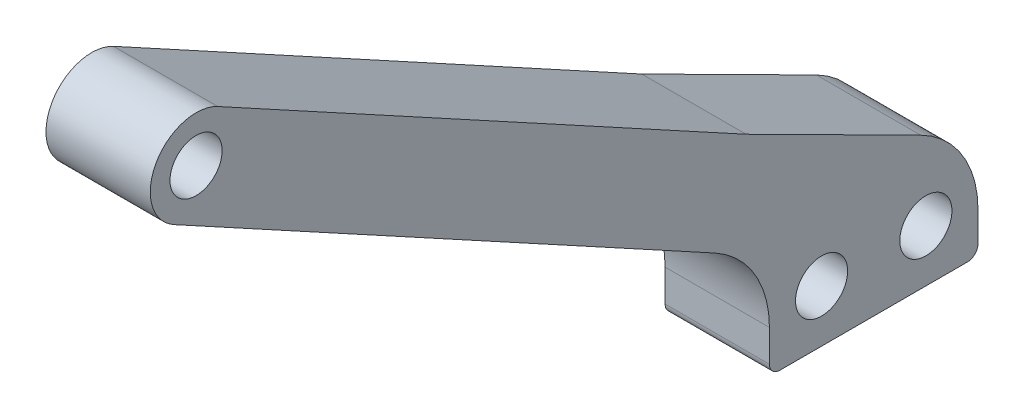
ISO-10303-21;
HEADER;
FILE_DESCRIPTION(('STEP AP214'),'2;1');
FILE_NAME('part.step','',(''),(''),'','','');
FILE_SCHEMA(('AUTOMOTIVE_DESIGN { 1 0 10303 214 1 1 1 1 }'));
ENDSEC;
DATA;
#1=APPLICATION_CONTEXT('core data for automotive mechanical design processes');
#2=APPLICATION_PROTOCOL_DEFINITION('international standard','automotive_design',2000,#1);
#3=PRODUCT_CONTEXT('',#1,'mechanical');
#4=PRODUCT('Part','Part','',(#3));
#5=PRODUCT_RELATED_PRODUCT_CATEGORY('part','',(#4));
#6=PRODUCT_DEFINITION_FORMATION('','',#4);
#7=PRODUCT_DEFINITION_CONTEXT('part definition',#1,'design');
#8=PRODUCT_DEFINITION('design','',#6,#7);
#9=PRODUCT_DEFINITION_SHAPE('','',#8);
#10=(LENGTH_UNIT() NAMED_UNIT(*) SI_UNIT(.MILLI.,.METRE.));
#11=(NAMED_UNIT(*) PLANE_ANGLE_UNIT() SI_UNIT($,.RADIAN.));
#12=(NAMED_UNIT(*) SI_UNIT($,.STERADIAN.) SOLID_ANGLE_UNIT());
#13=UNCERTAINTY_MEASURE_WITH_UNIT(LENGTH_MEASURE(1.E-05),#10,'distance_accuracy_value','');
#14=(GEOMETRIC_REPRESENTATION_CONTEXT(3) GLOBAL_UNCERTAINTY_ASSIGNED_CONTEXT((#13)) GLOBAL_UNIT_ASSIGNED_CONTEXT((#10,
#11,#12)) REPRESENTATION_CONTEXT('',''));
#15=CARTESIAN_POINT('',(0.,0.,0.));
#16=DIRECTION('',(0.,0.,1.));
#17=DIRECTION('',(1.,0.,0.));
#18=AXIS2_PLACEMENT_3D('',#15,#16,#17);
#19=CARTESIAN_POINT('',(10.,-5.93632289258122,10.));
#20=DIRECTION('',(-1.,0.,0.));
#21=DIRECTION('',(0.,0.,1.));
#22=AXIS2_PLACEMENT_3D('',#19,#20,#21);
#23=CYLINDRICAL_SURFACE('',#22,10.);
#24=CARTESIAN_POINT('',(0.,-5.93632289258122,10.));
#25=DIRECTION('',(1.,0.,0.));
#26=DIRECTION('',(0.,0.,-1.));
#27=AXIS2_PLACEMENT_3D('',#24,#25,#26);
#28=CIRCLE('',#27,10.);
#29=CARTESIAN_POINT('',(0.,-5.93632289258126,0.));
#30=VERTEX_POINT('',#29);
#31=CARTESIAN_POINT('',(0.,2.84262710419524,5.21146818386901));
#32=VERTEX_POINT('',#31);
#33=EDGE_CURVE('E155',#30,#32,#28,.T.);
#34=ORIENTED_EDGE('',*,*,#33,.F.);
#35=DIRECTION('',(-1.,0.,0.));
#36=VECTOR('',#35,1.);
#37=CARTESIAN_POINT('',(10.,-5.93632289258126,0.));
#38=LINE('',#37,#36);
#39=CARTESIAN_POINT('',(10.,-5.93632289258126,0.));
#40=VERTEX_POINT('',#39);
#41=EDGE_CURVE('E11',#40,#30,#38,.T.);
#42=ORIENTED_EDGE('',*,*,#41,.F.);
#43=CARTESIAN_POINT('',(10.,-5.93632289258122,10.));
#44=DIRECTION('',(1.,0.,0.));
#45=DIRECTION('',(0.,0.,-1.));
#46=AXIS2_PLACEMENT_3D('',#43,#44,#45);
#47=CIRCLE('',#46,10.);
#48=CARTESIAN_POINT('',(10.,2.84262710419524,5.21146818386901));
#49=VERTEX_POINT('',#48);
#50=EDGE_CURVE('E190',#40,#49,#47,.T.);
#51=ORIENTED_EDGE('',*,*,#50,.T.);
#52=DIRECTION('',(-1.,0.,0.));
#53=VECTOR('',#52,1.);
#54=CARTESIAN_POINT('',(10.,2.84262710419524,5.21146818386901));
#55=LINE('',#54,#53);
#56=EDGE_CURVE('E96',#49,#32,#55,.T.);
#57=ORIENTED_EDGE('',*,*,#56,.T.);
#58=EDGE_LOOP('',(#34,#42,#51,#57));
#59=FACE_BOUND('',#58,.T.);
#60=ADVANCED_FACE('F36',(#59),#23,.F.);
#61=CARTESIAN_POINT('',(10.,0.,0.));
#62=DIRECTION('',(0.,0.,1.));
#63=DIRECTION('',(0.,-1.,0.));
#64=AXIS2_PLACEMENT_3D('',#61,#62,#63);
#65=PLANE('',#64);
#66=DIRECTION('',(0.,1.,0.));
#67=VECTOR('',#66,1.);
#68=CARTESIAN_POINT('',(0.,0.,0.));
#69=LINE('',#68,#67);
#70=CARTESIAN_POINT('',(0.,-8.99999999999999,0.));
#71=VERTEX_POINT('',#70);
#72=EDGE_CURVE('E158',#71,#30,#69,.T.);
#73=ORIENTED_EDGE('',*,*,#72,.F.);
#74=DIRECTION('',(-1.,0.,0.));
#75=VECTOR('',#74,1.);
#76=CARTESIAN_POINT('',(10.,-8.99999999999999,0.));
#77=LINE('',#76,#75);
#78=CARTESIAN_POINT('',(10.,-8.99999999999999,0.));
#79=VERTEX_POINT('',#78);
#80=EDGE_CURVE('E44',#79,#71,#77,.T.);
#81=ORIENTED_EDGE('',*,*,#80,.F.);
#82=DIRECTION('',(0.,1.,0.));
#83=VECTOR('',#82,1.);
#84=CARTESIAN_POINT('',(10.,0.,0.));
#85=LINE('',#84,#83);
#86=EDGE_CURVE('E228',#79,#40,#85,.T.);
#87=ORIENTED_EDGE('',*,*,#86,.T.);
#88=ORIENTED_EDGE('',*,*,#41,.T.);
#89=EDGE_LOOP('',(#73,#81,#87,#88));
#90=FACE_BOUND('',#89,.T.);
#91=ADVANCED_FACE('F215',(#90),#65,.T.);
#92=CARTESIAN_POINT('',(10.,-9.,-1.));
#93=DIRECTION('',(-1.,0.,0.));
#94=DIRECTION('',(0.,0.,1.));
#95=AXIS2_PLACEMENT_3D('',#92,#93,#94);
#96=CYLINDRICAL_SURFACE('',#95,1.);
#97=CARTESIAN_POINT('',(0.,-9.,-1.));
#98=DIRECTION('',(1.,0.,0.));
#99=DIRECTION('',(0.,0.,-1.));
#100=AXIS2_PLACEMENT_3D('',#97,#98,#99);
#101=CIRCLE('',#100,1.);
#102=CARTESIAN_POINT('',(0.,-10.,-1.00000000000001));
#103=VERTEX_POINT('',#102);
#104=EDGE_CURVE('E161',#103,#71,#101,.F.);
#105=ORIENTED_EDGE('',*,*,#104,.F.);
#106=DIRECTION('',(-1.,0.,0.));
#107=VECTOR('',#106,1.);
#108=CARTESIAN_POINT('',(10.,-10.,-1.00000000000001));
#109=LINE('',#108,#107);
#110=CARTESIAN_POINT('',(10.,-10.,-1.00000000000001));
#111=VERTEX_POINT('',#110);
#112=EDGE_CURVE('E204',#111,#103,#109,.T.);
#113=ORIENTED_EDGE('',*,*,#112,.F.);
#114=CARTESIAN_POINT('',(10.,-9.,-1.));
#115=DIRECTION('',(1.,0.,0.));
#116=DIRECTION('',(0.,0.,-1.));
#117=AXIS2_PLACEMENT_3D('',#114,#115,#116);
#118=CIRCLE('',#117,1.);
#119=EDGE_CURVE('E211',#111,#79,#118,.F.);
#120=ORIENTED_EDGE('',*,*,#119,.T.);
#121=ORIENTED_EDGE('',*,*,#80,.T.);
#122=EDGE_LOOP('',(#105,#113,#120,#121));
#123=FACE_BOUND('',#122,.T.);
#124=ADVANCED_FACE('F209',(#123),#96,.T.);
#125=CARTESIAN_POINT('',(10.,-10.,0.));
#126=DIRECTION('',(0.,-1.,0.));
#127=DIRECTION('',(0.,0.,-1.));
#128=AXIS2_PLACEMENT_3D('',#125,#126,#127);
#129=PLANE('',#128);
#130=DIRECTION('',(0.,0.,1.));
#131=VECTOR('',#130,1.);
#132=CARTESIAN_POINT('',(0.,-10.,0.));
#133=LINE('',#132,#131);
#134=CARTESIAN_POINT('',(0.,-10.,-19.));
#135=VERTEX_POINT('',#134);
#136=EDGE_CURVE('E164',#135,#103,#133,.T.);
#137=ORIENTED_EDGE('',*,*,#136,.F.);
#138=DIRECTION('',(-1.,0.,0.));
#139=VECTOR('',#138,1.);
#140=CARTESIAN_POINT('',(10.,-10.,-19.));
#141=LINE('',#140,#139);
#142=CARTESIAN_POINT('',(10.,-10.,-19.));
#143=VERTEX_POINT('',#142);
#144=EDGE_CURVE('E202',#143,#135,#141,.T.);
#145=ORIENTED_EDGE('',*,*,#144,.F.);
#146=DIRECTION('',(0.,0.,1.));
#147=VECTOR('',#146,1.);
#148=CARTESIAN_POINT('',(10.,-10.,0.));
#149=LINE('',#148,#147);
#150=EDGE_CURVE('E227',#143,#111,#149,.T.);
#151=ORIENTED_EDGE('',*,*,#150,.T.);
#152=ORIENTED_EDGE('',*,*,#112,.T.);
#153=EDGE_LOOP('',(#137,#145,#151,#152));
#154=FACE_BOUND('',#153,.T.);
#155=ADVANCED_FACE('F223',(#154),#129,.T.);
#156=CARTESIAN_POINT('',(10.,-9.,-19.));
#157=DIRECTION('',(-1.,0.,0.));
#158=DIRECTION('',(0.,0.,1.));
#159=AXIS2_PLACEMENT_3D('',#156,#157,#158);
#160=CYLINDRICAL_SURFACE('',#159,1.);
#161=CARTESIAN_POINT('',(0.,-9.,-19.));
#162=DIRECTION('',(1.,0.,0.));
#163=DIRECTION('',(0.,0.,-1.));
#164=AXIS2_PLACEMENT_3D('',#161,#162,#163);
#165=CIRCLE('',#164,1.);
#166=CARTESIAN_POINT('',(0.,-8.99999999999999,-20.));
#167=VERTEX_POINT('',#166);
#168=EDGE_CURVE('E167',#135,#167,#165,.T.);
#169=ORIENTED_EDGE('',*,*,#168,.T.);
#170=DIRECTION('',(-1.,0.,0.));
#171=VECTOR('',#170,1.);
#172=CARTESIAN_POINT('',(10.,-8.99999999999999,-20.));
#173=LINE('',#172,#171);
#174=CARTESIAN_POINT('',(10.,-8.99999999999999,-20.));
#175=VERTEX_POINT('',#174);
#176=EDGE_CURVE('E199',#175,#167,#173,.T.);
#177=ORIENTED_EDGE('',*,*,#176,.F.);
#178=CARTESIAN_POINT('',(10.,-9.,-19.));
#179=DIRECTION('',(1.,0.,0.));
#180=DIRECTION('',(0.,0.,-1.));
#181=AXIS2_PLACEMENT_3D('',#178,#179,#180);
#182=CIRCLE('',#181,1.);
#183=EDGE_CURVE('E230',#143,#175,#182,.T.);
#184=ORIENTED_EDGE('',*,*,#183,.F.);
#185=ORIENTED_EDGE('',*,*,#144,.T.);
#186=EDGE_LOOP('',(#169,#177,#184,#185));
#187=FACE_BOUND('',#186,.T.);
#188=ADVANCED_FACE('F258',(#187),#160,.T.);
#189=CARTESIAN_POINT('',(10.,0.,-20.));
#190=DIRECTION('',(0.,0.,1.));
#191=DIRECTION('',(1.,0.,0.));
#192=AXIS2_PLACEMENT_3D('',#189,#190,#191);
#193=PLANE('',#192);
#194=DIRECTION('',(0.,1.,0.));
#195=VECTOR('',#194,1.);
#196=CARTESIAN_POINT('',(0.,0.,-20.));
#197=LINE('',#196,#195);
#198=CARTESIAN_POINT('',(0.,-6.15512164632231,-20.));
#199=VERTEX_POINT('',#198);
#200=EDGE_CURVE('E169',#167,#199,#197,.T.);
#201=ORIENTED_EDGE('',*,*,#200,.T.);
#202=DIRECTION('',(-1.,0.,0.));
#203=VECTOR('',#202,1.);
#204=CARTESIAN_POINT('',(10.,-6.15512164632231,-20.));
#205=LINE('',#204,#203);
#206=CARTESIAN_POINT('',(10.,-6.15512164632231,-20.));
#207=VERTEX_POINT('',#206);
#208=EDGE_CURVE('E196',#207,#199,#205,.T.);
#209=ORIENTED_EDGE('',*,*,#208,.F.);
#210=DIRECTION('',(0.,1.,0.));
#211=VECTOR('',#210,1.);
#212=CARTESIAN_POINT('',(10.,0.,-20.));
#213=LINE('',#212,#211);
#214=EDGE_CURVE('E236',#175,#207,#213,.T.);
#215=ORIENTED_EDGE('',*,*,#214,.F.);
#216=ORIENTED_EDGE('',*,*,#176,.T.);
#217=EDGE_LOOP('',(#201,#209,#215,#216));
#218=FACE_BOUND('',#217,.T.);
#219=ADVANCED_FACE('F261',(#218),#193,.F.);
#220=CARTESIAN_POINT('',(10.,-6.15512164632227,-9.99999999999999));
#221=DIRECTION('',(-1.,0.,0.));
#222=DIRECTION('',(0.,0.,1.));
#223=AXIS2_PLACEMENT_3D('',#220,#221,#222);
#224=CYLINDRICAL_SURFACE('',#223,10.);
#225=CARTESIAN_POINT('',(0.,-6.15512164632227,-9.99999999999999));
#226=DIRECTION('',(1.,0.,0.));
#227=DIRECTION('',(0.,0.,-1.));
#228=AXIS2_PLACEMENT_3D('',#225,#226,#227);
#229=CIRCLE('',#228,10.);
#230=CARTESIAN_POINT('',(0.,2.77275059953925,-14.5047860283898));
#231=VERTEX_POINT('',#230);
#232=EDGE_CURVE('E171',#199,#231,#229,.T.);
#233=ORIENTED_EDGE('',*,*,#232,.T.);
#234=DIRECTION('',(-1.,0.,0.));
#235=VECTOR('',#234,1.);
#236=CARTESIAN_POINT('',(10.,2.77275059953925,-14.5047860283898));
#237=LINE('',#236,#235);
#238=CARTESIAN_POINT('',(10.,2.77275059953925,-14.5047860283898));
#239=VERTEX_POINT('',#238);
#240=EDGE_CURVE('E194',#239,#231,#237,.T.);
#241=ORIENTED_EDGE('',*,*,#240,.F.);
#242=CARTESIAN_POINT('',(10.,-6.15512164632227,-9.99999999999999));
#243=DIRECTION('',(1.,0.,0.));
#244=DIRECTION('',(0.,0.,-1.));
#245=AXIS2_PLACEMENT_3D('',#242,#243,#244);
#246=CIRCLE('',#245,10.);
#247=EDGE_CURVE('E238',#207,#239,#246,.T.);
#248=ORIENTED_EDGE('',*,*,#247,.F.);
#249=ORIENTED_EDGE('',*,*,#208,.T.);
#250=EDGE_LOOP('',(#233,#241,#248,#249));
#251=FACE_BOUND('',#250,.T.);
#252=ADVANCED_FACE('F265',(#251),#224,.T.);
#253=CARTESIAN_POINT('',(10.,8.04363083128121,-4.05861943231522));
#254=DIRECTION('',(0.,0.892787224586149,-0.450478602838982));
#255=DIRECTION('',(0.,0.450478602838982,0.892787224586149));
#256=AXIS2_PLACEMENT_3D('',#253,#254,#255);
#257=PLANE('',#256);
#258=DIRECTION('',(0.,-0.450478602838982,-0.892787224586149));
#259=VECTOR('',#258,1.);
#260=CARTESIAN_POINT('',(0.,8.04363083128121,-4.05861943231522));
#261=LINE('',#260,#259);
#262=CARTESIAN_POINT('',(0.,11.2210442708562,2.23858116323632));
#263=VERTEX_POINT('',#262);
#264=EDGE_CURVE('E174',#263,#231,#261,.T.);
#265=ORIENTED_EDGE('',*,*,#264,.F.);
#266=DIRECTION('',(-1.,0.,0.));
#267=VECTOR('',#266,1.);
#268=CARTESIAN_POINT('',(10.,11.2210442708562,2.23858116323632));
#269=LINE('',#268,#267);
#270=CARTESIAN_POINT('',(10.,11.2210442708562,2.23858116323632));
#271=VERTEX_POINT('',#270);
#272=EDGE_CURVE('E138',#271,#263,#269,.T.);
#273=ORIENTED_EDGE('',*,*,#272,.F.);
#274=DIRECTION('',(0.,-0.450478602838982,-0.892787224586149));
#275=VECTOR('',#274,1.);
#276=CARTESIAN_POINT('',(10.,8.04363083128121,-4.05861943231522));
#277=LINE('',#276,#275);
#278=EDGE_CURVE('E131',#271,#239,#277,.T.);
#279=ORIENTED_EDGE('',*,*,#278,.T.);
#280=ORIENTED_EDGE('',*,*,#240,.T.);
#281=EDGE_LOOP('',(#265,#273,#279,#280));
#282=FACE_BOUND('',#281,.T.);
#283=ADVANCED_FACE('F241',(#282),#257,.T.);
#284=CARTESIAN_POINT('',(10.,7.70700636942674,-4.20382165605097));
#285=DIRECTION('',(0.,-0.877895572914384,0.478852130680575));
#286=DIRECTION('',(0.,-0.478852130680575,-0.877895572914384));
#287=AXIS2_PLACEMENT_3D('',#284,#285,#286);
#288=PLANE('',#287);
#289=DIRECTION('',(0.,0.478852130680575,0.877895572914384));
#290=VECTOR('',#289,1.);
#291=CARTESIAN_POINT('',(0.,7.70700636942674,-4.20382165605097));
#292=LINE('',#291,#290);
#293=CARTESIAN_POINT('',(0.,38.8535031847135,52.8980891719745));
#294=VERTEX_POINT('',#293);
#295=EDGE_CURVE('E137',#263,#294,#292,.T.);
#296=ORIENTED_EDGE('',*,*,#295,.T.);
#297=DIRECTION('',(-1.,0.,0.));
#298=VECTOR('',#297,1.);
#299=CARTESIAN_POINT('',(10.,38.8535031847135,52.8980891719745));
#300=LINE('',#299,#298);
#301=CARTESIAN_POINT('',(10.,38.8535031847135,52.8980891719745));
#302=VERTEX_POINT('',#301);
#303=EDGE_CURVE('E134',#302,#294,#300,.T.);
#304=ORIENTED_EDGE('',*,*,#303,.F.);
#305=DIRECTION('',(0.,0.478852130680575,0.877895572914384));
#306=VECTOR('',#305,1.);
#307=CARTESIAN_POINT('',(10.,7.70700636942674,-4.20382165605097));
#308=LINE('',#307,#306);
#309=EDGE_CURVE('E124',#271,#302,#308,.T.);
#310=ORIENTED_EDGE('',*,*,#309,.F.);
#311=ORIENTED_EDGE('',*,*,#272,.T.);
#312=EDGE_LOOP('',(#296,#304,#310,#311));
#313=FACE_BOUND('',#312,.T.);
#314=ADVANCED_FACE('F135',(#313),#288,.F.);
#315=CARTESIAN_POINT('',(10.,34.9875512329165,54.9770147189733));
#316=DIRECTION('',(-1.,0.,0.));
#317=DIRECTION('',(0.,0.,1.));
#318=AXIS2_PLACEMENT_3D('',#315,#316,#317);
#319=CYLINDRICAL_SURFACE('',#318,4.38947786457199);
#320=CARTESIAN_POINT('',(0.,34.9875512329165,54.9770147189733));
#321=DIRECTION('',(1.,0.,0.));
#322=DIRECTION('',(0.,0.,-1.));
#323=AXIS2_PLACEMENT_3D('',#320,#321,#322);
#324=CIRCLE('',#323,4.38947786457199);
#325=CARTESIAN_POINT('',(0.,31.134050564413,57.0789301600439));
#326=VERTEX_POINT('',#325);
#327=EDGE_CURVE('E89',#294,#326,#324,.T.);
#328=ORIENTED_EDGE('',*,*,#327,.T.);
#329=DIRECTION('',(-1.,0.,0.));
#330=VECTOR('',#329,1.);
#331=CARTESIAN_POINT('',(10.,31.134050564413,57.0789301600439));
#332=LINE('',#331,#330);
#333=CARTESIAN_POINT('',(10.,31.134050564413,57.0789301600439));
#334=VERTEX_POINT('',#333);
#335=EDGE_CURVE('E139',#334,#326,#332,.T.);
#336=ORIENTED_EDGE('',*,*,#335,.F.);
#337=CARTESIAN_POINT('',(10.,34.9875512329165,54.9770147189733));
#338=DIRECTION('',(1.,0.,0.));
#339=DIRECTION('',(0.,0.,-1.));
#340=AXIS2_PLACEMENT_3D('',#337,#338,#339);
#341=CIRCLE('',#340,4.38947786457199);
#342=EDGE_CURVE('E129',#302,#334,#341,.T.);
#343=ORIENTED_EDGE('',*,*,#342,.F.);
#344=ORIENTED_EDGE('',*,*,#303,.T.);
#345=EDGE_LOOP('',(#328,#336,#343,#344));
#346=FACE_BOUND('',#345,.T.);
#347=ADVANCED_FACE('F141',(#346),#319,.T.);
#348=CARTESIAN_POINT('',(10.,-5.,-5.));
#349=DIRECTION('',(-1.,0.,0.));
#350=DIRECTION('',(0.,0.,1.));
#351=AXIS2_PLACEMENT_3D('',#348,#349,#350);
#352=CYLINDRICAL_SURFACE('',#351,2.5);
#353=CARTESIAN_POINT('',(10.,-5.,-5.));
#354=DIRECTION('',(1.,0.,0.));
#355=DIRECTION('',(0.,0.,-1.));
#356=AXIS2_PLACEMENT_3D('',#353,#354,#355);
#357=CIRCLE('',#356,2.5);
#358=CARTESIAN_POINT('',(10.,-5.,-7.5));
#359=VERTEX_POINT('',#358);
#360=EDGE_CURVE('E149',#359,#359,#357,.T.);
#361=ORIENTED_EDGE('',*,*,#360,.T.);
#362=EDGE_LOOP('',(#361));
#363=FACE_BOUND('',#362,.T.);
#364=CARTESIAN_POINT('',(0.,-5.,-5.));
#365=DIRECTION('',(1.,0.,0.));
#366=DIRECTION('',(0.,0.,-1.));
#367=AXIS2_PLACEMENT_3D('',#364,#365,#366);
#368=CIRCLE('',#367,2.5);
#369=CARTESIAN_POINT('',(0.,-5.,-7.5));
#370=VERTEX_POINT('',#369);
#371=EDGE_CURVE('E184',#370,#370,#368,.T.);
#372=ORIENTED_EDGE('',*,*,#371,.F.);
#373=EDGE_LOOP('',(#372));
#374=FACE_BOUND('',#373,.T.);
#375=ADVANCED_FACE('F276',(#363,#374),#352,.F.);
#376=CARTESIAN_POINT('',(10.,-5.,-15.));
#377=DIRECTION('',(-1.,0.,0.));
#378=DIRECTION('',(0.,0.,1.));
#379=AXIS2_PLACEMENT_3D('',#376,#377,#378);
#380=CYLINDRICAL_SURFACE('',#379,2.5);
#381=CARTESIAN_POINT('',(10.,-5.,-15.));
#382=DIRECTION('',(1.,0.,0.));
#383=DIRECTION('',(0.,0.,-1.));
#384=AXIS2_PLACEMENT_3D('',#381,#382,#383);
#385=CIRCLE('',#384,2.5);
#386=CARTESIAN_POINT('',(10.,-5.,-17.5));
#387=VERTEX_POINT('',#386);
#388=EDGE_CURVE('E143',#387,#387,#385,.T.);
#389=ORIENTED_EDGE('',*,*,#388,.T.);
#390=EDGE_LOOP('',(#389));
#391=FACE_BOUND('',#390,.T.);
#392=CARTESIAN_POINT('',(0.,-5.,-15.));
#393=DIRECTION('',(1.,0.,0.));
#394=DIRECTION('',(0.,0.,-1.));
#395=AXIS2_PLACEMENT_3D('',#392,#393,#394);
#396=CIRCLE('',#395,2.5);
#397=CARTESIAN_POINT('',(0.,-5.,-17.5));
#398=VERTEX_POINT('',#397);
#399=EDGE_CURVE('E181',#398,#398,#396,.T.);
#400=ORIENTED_EDGE('',*,*,#399,.F.);
#401=EDGE_LOOP('',(#400));
#402=FACE_BOUND('',#401,.T.);
#403=ADVANCED_FACE('F280',(#391,#402),#380,.F.);
#404=CARTESIAN_POINT('',(10.,0.,0.));
#405=DIRECTION('',(0.,0.877894999677643,-0.478853181613103));
#406=DIRECTION('',(0.,0.478853181613103,0.877894999677643));
#407=AXIS2_PLACEMENT_3D('',#404,#405,#406);
#408=PLANE('',#407);
#409=DIRECTION('',(0.,-0.478853181613103,-0.877894999677643));
#410=VECTOR('',#409,1.);
#411=CARTESIAN_POINT('',(0.,0.,0.));
#412=LINE('',#411,#410);
#413=EDGE_CURVE('E179',#326,#32,#412,.T.);
#414=ORIENTED_EDGE('',*,*,#413,.T.);
#415=ORIENTED_EDGE('',*,*,#56,.F.);
#416=DIRECTION('',(0.,-0.478853181613103,-0.877894999677643));
#417=VECTOR('',#416,1.);
#418=CARTESIAN_POINT('',(10.,0.,0.));
#419=LINE('',#418,#417);
#420=EDGE_CURVE('E52',#334,#49,#419,.T.);
#421=ORIENTED_EDGE('',*,*,#420,.F.);
#422=ORIENTED_EDGE('',*,*,#335,.T.);
#423=EDGE_LOOP('',(#414,#415,#421,#422));
#424=FACE_BOUND('',#423,.T.);
#425=ADVANCED_FACE('F246',(#424),#408,.F.);
#426=CARTESIAN_POINT('',(10.,34.9875512329165,54.9770147189733));
#427=DIRECTION('',(-1.,0.,0.));
#428=DIRECTION('',(0.,0.,1.));
#429=AXIS2_PLACEMENT_3D('',#426,#427,#428);
#430=CYLINDRICAL_SURFACE('',#429,2.49999999999836);
#431=CARTESIAN_POINT('',(10.,34.9875512329165,54.9770147189733));
#432=DIRECTION('',(1.,0.,0.));
#433=DIRECTION('',(0.,0.,-1.));
#434=AXIS2_PLACEMENT_3D('',#431,#432,#433);
#435=CIRCLE('',#434,2.49999999999836);
#436=CARTESIAN_POINT('',(10.,34.9875512329165,52.477014718975));
#437=VERTEX_POINT('',#436);
#438=EDGE_CURVE('E152',#437,#437,#435,.T.);
#439=ORIENTED_EDGE('',*,*,#438,.T.);
#440=EDGE_LOOP('',(#439));
#441=FACE_BOUND('',#440,.T.);
#442=CARTESIAN_POINT('',(0.,34.9875512329165,54.9770147189733));
#443=DIRECTION('',(1.,0.,0.));
#444=DIRECTION('',(0.,0.,-1.));
#445=AXIS2_PLACEMENT_3D('',#442,#443,#444);
#446=CIRCLE('',#445,2.49999999999836);
#447=CARTESIAN_POINT('',(0.,34.9875512329165,52.477014718975));
#448=VERTEX_POINT('',#447);
#449=EDGE_CURVE('E187',#448,#448,#446,.T.);
#450=ORIENTED_EDGE('',*,*,#449,.F.);
#451=EDGE_LOOP('',(#450));
#452=FACE_BOUND('',#451,.T.);
#453=ADVANCED_FACE('F279',(#441,#452),#430,.F.);
#454=CARTESIAN_POINT('',(10.,0.,0.));
#455=DIRECTION('',(1.,0.,0.));
#456=DIRECTION('',(0.,0.,-1.));
#457=AXIS2_PLACEMENT_3D('',#454,#455,#456);
#458=PLANE('',#457);
#459=ORIENTED_EDGE('',*,*,#50,.F.);
#460=ORIENTED_EDGE('',*,*,#86,.F.);
#461=ORIENTED_EDGE('',*,*,#119,.F.);
#462=ORIENTED_EDGE('',*,*,#150,.F.);
#463=ORIENTED_EDGE('',*,*,#183,.T.);
#464=ORIENTED_EDGE('',*,*,#214,.T.);
#465=ORIENTED_EDGE('',*,*,#247,.T.);
#466=ORIENTED_EDGE('',*,*,#278,.F.);
#467=ORIENTED_EDGE('',*,*,#309,.T.);
#468=ORIENTED_EDGE('',*,*,#342,.T.);
#469=ORIENTED_EDGE('',*,*,#420,.T.);
#470=EDGE_LOOP('',(#459,#460,#461,#462,#463,#464,#465,#466,#467,#468,#469));
#471=FACE_BOUND('',#470,.T.);
#472=ORIENTED_EDGE('',*,*,#388,.F.);
#473=EDGE_LOOP('',(#472));
#474=FACE_BOUND('',#473,.T.);
#475=ORIENTED_EDGE('',*,*,#360,.F.);
#476=EDGE_LOOP('',(#475));
#477=FACE_BOUND('',#476,.T.);
#478=ORIENTED_EDGE('',*,*,#438,.F.);
#479=EDGE_LOOP('',(#478));
#480=FACE_BOUND('',#479,.T.);
#481=ADVANCED_FACE('F126',(#471,#474,#477,#480),#458,.T.);
#482=CARTESIAN_POINT('',(0.,0.,0.));
#483=DIRECTION('',(1.,0.,0.));
#484=DIRECTION('',(0.,0.,-1.));
#485=AXIS2_PLACEMENT_3D('',#482,#483,#484);
#486=PLANE('',#485);
#487=ORIENTED_EDGE('',*,*,#33,.T.);
#488=ORIENTED_EDGE('',*,*,#413,.F.);
#489=ORIENTED_EDGE('',*,*,#327,.F.);
#490=ORIENTED_EDGE('',*,*,#295,.F.);
#491=ORIENTED_EDGE('',*,*,#264,.T.);
#492=ORIENTED_EDGE('',*,*,#232,.F.);
#493=ORIENTED_EDGE('',*,*,#200,.F.);
#494=ORIENTED_EDGE('',*,*,#168,.F.);
#495=ORIENTED_EDGE('',*,*,#136,.T.);
#496=ORIENTED_EDGE('',*,*,#104,.T.);
#497=ORIENTED_EDGE('',*,*,#72,.T.);
#498=EDGE_LOOP('',(#487,#488,#489,#490,#491,#492,#493,#494,#495,#496,#497));
#499=FACE_BOUND('',#498,.T.);
#500=ORIENTED_EDGE('',*,*,#399,.T.);
#501=EDGE_LOOP('',(#500));
#502=FACE_BOUND('',#501,.T.);
#503=ORIENTED_EDGE('',*,*,#371,.T.);
#504=EDGE_LOOP('',(#503));
#505=FACE_BOUND('',#504,.T.);
#506=ORIENTED_EDGE('',*,*,#449,.T.);
#507=EDGE_LOOP('',(#506));
#508=FACE_BOUND('',#507,.T.);
#509=ADVANCED_FACE('F217',(#499,#502,#505,#508),#486,.F.);
#510=CLOSED_SHELL('',(#60,#91,#124,#155,#188,#219,#252,#283,#314,#347,#375,#403,#425,#453,#481,#509));
#511=MANIFOLD_SOLID_BREP('B2',#510);
#512=ADVANCED_BREP_SHAPE_REPRESENTATION('',(#18,#511),#14);
#513=SHAPE_DEFINITION_REPRESENTATION(#9,#512);
ENDSEC;
END-ISO-10303-21;
